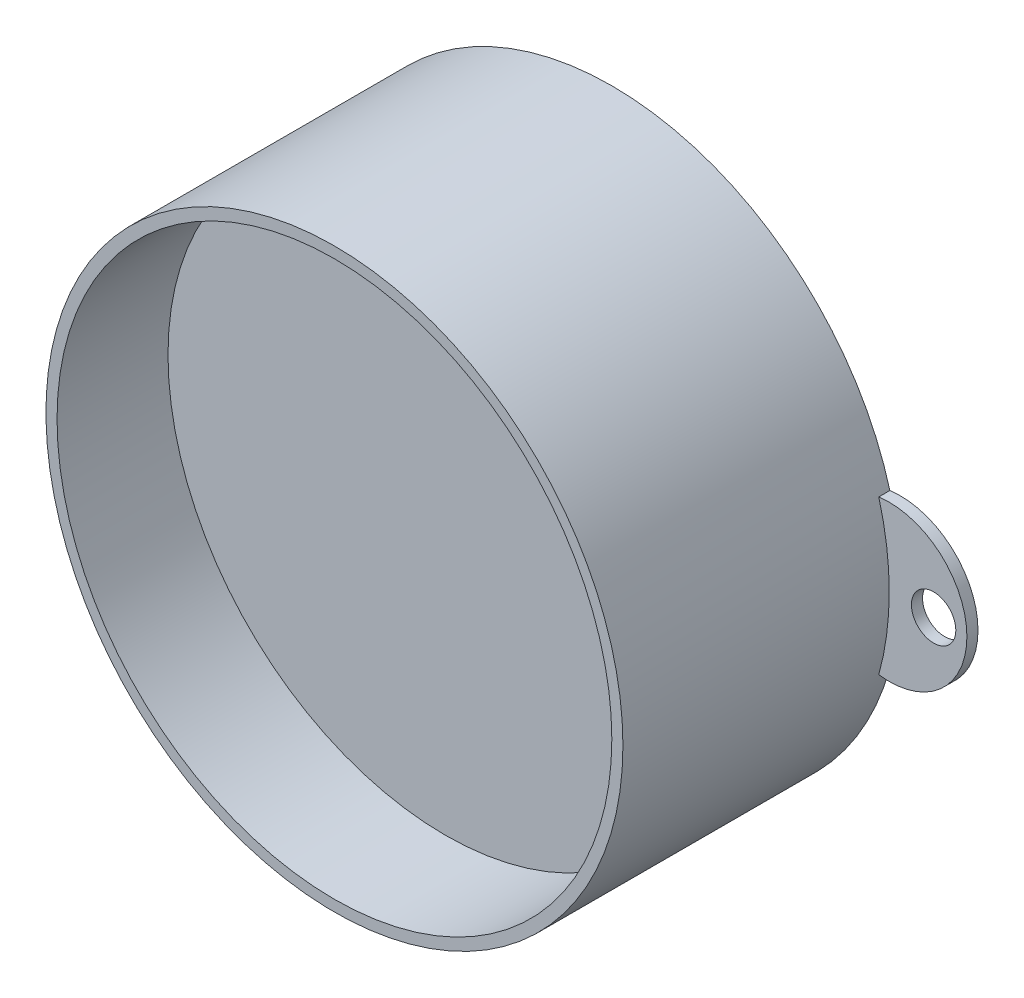
ISO-10303-21;
HEADER;
FILE_DESCRIPTION(('STEP AP214'),'2;1');
FILE_NAME('part.step','',(''),(''),'','','');
FILE_SCHEMA(('AUTOMOTIVE_DESIGN { 1 0 10303 214 1 1 1 1 }'));
ENDSEC;
DATA;
#1=APPLICATION_CONTEXT('core data for automotive mechanical design processes');
#2=APPLICATION_PROTOCOL_DEFINITION('international standard','automotive_design',2000,#1);
#3=PRODUCT_CONTEXT('',#1,'mechanical');
#4=PRODUCT('Part','Part','',(#3));
#5=PRODUCT_RELATED_PRODUCT_CATEGORY('part','',(#4));
#6=PRODUCT_DEFINITION_FORMATION('','',#4);
#7=PRODUCT_DEFINITION_CONTEXT('part definition',#1,'design');
#8=PRODUCT_DEFINITION('design','',#6,#7);
#9=PRODUCT_DEFINITION_SHAPE('','',#8);
#10=(LENGTH_UNIT() NAMED_UNIT(*) SI_UNIT(.MILLI.,.METRE.));
#11=(NAMED_UNIT(*) PLANE_ANGLE_UNIT() SI_UNIT($,.RADIAN.));
#12=(NAMED_UNIT(*) SI_UNIT($,.STERADIAN.) SOLID_ANGLE_UNIT());
#13=UNCERTAINTY_MEASURE_WITH_UNIT(LENGTH_MEASURE(1.E-05),#10,'distance_accuracy_value','');
#14=(GEOMETRIC_REPRESENTATION_CONTEXT(3) GLOBAL_UNCERTAINTY_ASSIGNED_CONTEXT((#13)) GLOBAL_UNIT_ASSIGNED_CONTEXT((#10,
#11,#12)) REPRESENTATION_CONTEXT('',''));
#15=CARTESIAN_POINT('',(0.,0.,0.));
#16=DIRECTION('',(0.,0.,1.));
#17=DIRECTION('',(1.,0.,0.));
#18=AXIS2_PLACEMENT_3D('',#15,#16,#17);
#19=CARTESIAN_POINT('',(0.,0.,1.));
#20=DIRECTION('',(0.,0.,1.));
#21=DIRECTION('',(1.,0.,0.));
#22=AXIS2_PLACEMENT_3D('',#19,#20,#21);
#23=PLANE('',#22);
#24=CARTESIAN_POINT('',(-30.,0.,1.));
#25=DIRECTION('',(0.,0.,1.));
#26=DIRECTION('',(1.,0.,0.));
#27=AXIS2_PLACEMENT_3D('',#24,#25,#26);
#28=CIRCLE('',#27,2.);
#29=CARTESIAN_POINT('',(-28.,0.,1.));
#30=VERTEX_POINT('',#29);
#31=EDGE_CURVE('E100',#30,#30,#28,.T.);
#32=ORIENTED_EDGE('',*,*,#31,.F.);
#33=EDGE_LOOP('',(#32));
#34=FACE_BOUND('',#33,.T.);
#35=CARTESIAN_POINT('',(-26.,0.,1.));
#36=DIRECTION('',(0.,0.,1.));
#37=DIRECTION('',(1.,0.,0.));
#38=AXIS2_PLACEMENT_3D('',#35,#36,#37);
#39=CIRCLE('',#38,7.);
#40=CARTESIAN_POINT('',(-25.0576923076923,6.93628547660906,1.));
#41=VERTEX_POINT('',#40);
#42=CARTESIAN_POINT('',(-25.0576923076923,-6.93628547660906,1.));
#43=VERTEX_POINT('',#42);
#44=EDGE_CURVE('E106',#41,#43,#39,.T.);
#45=ORIENTED_EDGE('',*,*,#44,.T.);
#46=CARTESIAN_POINT('',(0.,0.,1.));
#47=DIRECTION('',(0.,0.,1.));
#48=DIRECTION('',(1.,0.,0.));
#49=AXIS2_PLACEMENT_3D('',#46,#47,#48);
#50=CIRCLE('',#49,26.);
#51=EDGE_CURVE('E84',#43,#41,#50,.F.);
#52=ORIENTED_EDGE('',*,*,#51,.T.);
#53=EDGE_LOOP('',(#45,#52));
#54=FACE_BOUND('',#53,.T.);
#55=ADVANCED_FACE('F33',(#34,#54),#23,.T.);
#56=CARTESIAN_POINT('',(26.,0.,1.));
#57=DIRECTION('',(0.,0.,-1.));
#58=DIRECTION('',(-1.,0.,0.));
#59=AXIS2_PLACEMENT_3D('',#56,#57,#58);
#60=CYLINDRICAL_SURFACE('',#59,7.);
#61=CARTESIAN_POINT('',(26.,0.,0.));
#62=DIRECTION('',(0.,0.,1.));
#63=DIRECTION('',(1.,0.,0.));
#64=AXIS2_PLACEMENT_3D('',#61,#62,#63);
#65=CIRCLE('',#64,7.);
#66=CARTESIAN_POINT('',(25.0576923076923,6.93628547660906,0.));
#67=VERTEX_POINT('',#66);
#68=CARTESIAN_POINT('',(25.0576923076923,-6.93628547660906,0.));
#69=VERTEX_POINT('',#68);
#70=EDGE_CURVE('E91',#67,#69,#65,.F.);
#71=ORIENTED_EDGE('',*,*,#70,.F.);
#72=DIRECTION('',(0.,0.,-1.));
#73=VECTOR('',#72,1.);
#74=CARTESIAN_POINT('',(25.0576923076923,6.93628547660906,1.));
#75=LINE('',#74,#73);
#76=CARTESIAN_POINT('',(25.0576923076923,6.93628547660906,1.));
#77=VERTEX_POINT('',#76);
#78=EDGE_CURVE('E11',#77,#67,#75,.T.);
#79=ORIENTED_EDGE('',*,*,#78,.F.);
#80=CARTESIAN_POINT('',(26.,0.,1.));
#81=DIRECTION('',(0.,0.,1.));
#82=DIRECTION('',(1.,0.,0.));
#83=AXIS2_PLACEMENT_3D('',#80,#81,#82);
#84=CIRCLE('',#83,7.);
#85=CARTESIAN_POINT('',(25.0576923076923,-6.93628547660906,1.));
#86=VERTEX_POINT('',#85);
#87=EDGE_CURVE('E108',#77,#86,#84,.F.);
#88=ORIENTED_EDGE('',*,*,#87,.T.);
#89=DIRECTION('',(0.,0.,-1.));
#90=VECTOR('',#89,1.);
#91=CARTESIAN_POINT('',(25.0576923076923,-6.93628547660906,1.));
#92=LINE('',#91,#90);
#93=EDGE_CURVE('E86',#86,#69,#92,.T.);
#94=ORIENTED_EDGE('',*,*,#93,.T.);
#95=EDGE_LOOP('',(#71,#79,#88,#94));
#96=FACE_BOUND('',#95,.T.);
#97=ADVANCED_FACE('F35',(#96),#60,.T.);
#98=CARTESIAN_POINT('',(-26.,0.,1.));
#99=DIRECTION('',(0.,0.,-1.));
#100=DIRECTION('',(-1.,0.,0.));
#101=AXIS2_PLACEMENT_3D('',#98,#99,#100);
#102=CYLINDRICAL_SURFACE('',#101,7.);
#103=CARTESIAN_POINT('',(-26.,0.,0.));
#104=DIRECTION('',(0.,0.,1.));
#105=DIRECTION('',(1.,0.,0.));
#106=AXIS2_PLACEMENT_3D('',#103,#104,#105);
#107=CIRCLE('',#106,7.);
#108=CARTESIAN_POINT('',(-25.0576923076923,6.93628547660906,0.));
#109=VERTEX_POINT('',#108);
#110=CARTESIAN_POINT('',(-25.0576923076923,-6.93628547660906,0.));
#111=VERTEX_POINT('',#110);
#112=EDGE_CURVE('E65',#109,#111,#107,.T.);
#113=ORIENTED_EDGE('',*,*,#112,.T.);
#114=DIRECTION('',(0.,0.,-1.));
#115=VECTOR('',#114,1.);
#116=CARTESIAN_POINT('',(-25.0576923076923,-6.93628547660906,1.));
#117=LINE('',#116,#115);
#118=EDGE_CURVE('E69',#43,#111,#117,.T.);
#119=ORIENTED_EDGE('',*,*,#118,.F.);
#120=ORIENTED_EDGE('',*,*,#44,.F.);
#121=DIRECTION('',(0.,0.,-1.));
#122=VECTOR('',#121,1.);
#123=CARTESIAN_POINT('',(-25.0576923076923,6.93628547660906,1.));
#124=LINE('',#123,#122);
#125=EDGE_CURVE('E42',#41,#109,#124,.T.);
#126=ORIENTED_EDGE('',*,*,#125,.T.);
#127=EDGE_LOOP('',(#113,#119,#120,#126));
#128=FACE_BOUND('',#127,.T.);
#129=ADVANCED_FACE('F67',(#128),#102,.T.);
#130=CARTESIAN_POINT('',(30.,0.,1.));
#131=DIRECTION('',(0.,0.,-1.));
#132=DIRECTION('',(-1.,0.,0.));
#133=AXIS2_PLACEMENT_3D('',#130,#131,#132);
#134=CYLINDRICAL_SURFACE('',#133,2.);
#135=CARTESIAN_POINT('',(30.,0.,1.));
#136=DIRECTION('',(0.,0.,1.));
#137=DIRECTION('',(1.,0.,0.));
#138=AXIS2_PLACEMENT_3D('',#135,#136,#137);
#139=CIRCLE('',#138,2.);
#140=CARTESIAN_POINT('',(32.,0.,1.));
#141=VERTEX_POINT('',#140);
#142=EDGE_CURVE('E103',#141,#141,#139,.F.);
#143=ORIENTED_EDGE('',*,*,#142,.F.);
#144=EDGE_LOOP('',(#143));
#145=FACE_BOUND('',#144,.T.);
#146=CARTESIAN_POINT('',(30.,0.,0.));
#147=DIRECTION('',(0.,0.,1.));
#148=DIRECTION('',(1.,0.,0.));
#149=AXIS2_PLACEMENT_3D('',#146,#147,#148);
#150=CIRCLE('',#149,2.);
#151=CARTESIAN_POINT('',(32.,0.,0.));
#152=VERTEX_POINT('',#151);
#153=EDGE_CURVE('E92',#152,#152,#150,.F.);
#154=ORIENTED_EDGE('',*,*,#153,.T.);
#155=EDGE_LOOP('',(#154));
#156=FACE_BOUND('',#155,.T.);
#157=ADVANCED_FACE('F136',(#145,#156),#134,.F.);
#158=CARTESIAN_POINT('',(0.,0.,1.));
#159=DIRECTION('',(0.,0.,-1.));
#160=DIRECTION('',(-1.,0.,0.));
#161=AXIS2_PLACEMENT_3D('',#158,#159,#160);
#162=CYLINDRICAL_SURFACE('',#161,26.);
#163=CARTESIAN_POINT('',(0.,0.,0.));
#164=DIRECTION('',(0.,0.,1.));
#165=DIRECTION('',(1.,0.,0.));
#166=AXIS2_PLACEMENT_3D('',#163,#164,#165);
#167=CIRCLE('',#166,26.);
#168=EDGE_CURVE('E74',#111,#69,#167,.T.);
#169=ORIENTED_EDGE('',*,*,#168,.T.);
#170=ORIENTED_EDGE('',*,*,#93,.F.);
#171=EDGE_CURVE('E48',#77,#86,#50,.F.);
#172=ORIENTED_EDGE('',*,*,#171,.F.);
#173=ORIENTED_EDGE('',*,*,#78,.T.);
#174=EDGE_CURVE('E75',#67,#109,#167,.T.);
#175=ORIENTED_EDGE('',*,*,#174,.T.);
#176=ORIENTED_EDGE('',*,*,#125,.F.);
#177=ORIENTED_EDGE('',*,*,#51,.F.);
#178=ORIENTED_EDGE('',*,*,#118,.T.);
#179=EDGE_LOOP('',(#169,#170,#172,#173,#175,#176,#177,#178));
#180=FACE_BOUND('',#179,.T.);
#181=CARTESIAN_POINT('',(0.,0.,25.));
#182=DIRECTION('',(0.,0.,1.));
#183=DIRECTION('',(1.,0.,0.));
#184=AXIS2_PLACEMENT_3D('',#181,#182,#183);
#185=CIRCLE('',#184,26.);
#186=CARTESIAN_POINT('',(26.,0.,25.));
#187=VERTEX_POINT('',#186);
#188=EDGE_CURVE('E111',#187,#187,#185,.T.);
#189=ORIENTED_EDGE('',*,*,#188,.F.);
#190=EDGE_LOOP('',(#189));
#191=FACE_BOUND('',#190,.T.);
#192=ADVANCED_FACE('F80',(#180,#191),#162,.T.);
#193=CARTESIAN_POINT('',(-30.,0.,1.));
#194=DIRECTION('',(0.,0.,-1.));
#195=DIRECTION('',(-1.,0.,0.));
#196=AXIS2_PLACEMENT_3D('',#193,#194,#195);
#197=CYLINDRICAL_SURFACE('',#196,2.);
#198=ORIENTED_EDGE('',*,*,#31,.T.);
#199=EDGE_LOOP('',(#198));
#200=FACE_BOUND('',#199,.T.);
#201=CARTESIAN_POINT('',(-30.,0.,0.));
#202=DIRECTION('',(0.,0.,1.));
#203=DIRECTION('',(1.,0.,0.));
#204=AXIS2_PLACEMENT_3D('',#201,#202,#203);
#205=CIRCLE('',#204,2.);
#206=CARTESIAN_POINT('',(-28.,0.,0.));
#207=VERTEX_POINT('',#206);
#208=EDGE_CURVE('E95',#207,#207,#205,.T.);
#209=ORIENTED_EDGE('',*,*,#208,.F.);
#210=EDGE_LOOP('',(#209));
#211=FACE_BOUND('',#210,.T.);
#212=ADVANCED_FACE('F135',(#200,#211),#197,.F.);
#213=ORIENTED_EDGE('',*,*,#87,.F.);
#214=ORIENTED_EDGE('',*,*,#171,.T.);
#215=EDGE_LOOP('',(#213,#214));
#216=FACE_BOUND('',#215,.T.);
#217=ORIENTED_EDGE('',*,*,#142,.T.);
#218=EDGE_LOOP('',(#217));
#219=FACE_BOUND('',#218,.T.);
#220=ADVANCED_FACE('F142',(#216,#219),#23,.T.);
#221=CARTESIAN_POINT('',(0.,0.,0.));
#222=DIRECTION('',(0.,0.,1.));
#223=DIRECTION('',(1.,0.,0.));
#224=AXIS2_PLACEMENT_3D('',#221,#222,#223);
#225=PLANE('',#224);
#226=ORIENTED_EDGE('',*,*,#70,.T.);
#227=ORIENTED_EDGE('',*,*,#168,.F.);
#228=ORIENTED_EDGE('',*,*,#112,.F.);
#229=ORIENTED_EDGE('',*,*,#174,.F.);
#230=EDGE_LOOP('',(#226,#227,#228,#229));
#231=FACE_BOUND('',#230,.T.);
#232=ORIENTED_EDGE('',*,*,#153,.F.);
#233=EDGE_LOOP('',(#232));
#234=FACE_BOUND('',#233,.T.);
#235=ORIENTED_EDGE('',*,*,#208,.T.);
#236=EDGE_LOOP('',(#235));
#237=FACE_BOUND('',#236,.T.);
#238=ADVANCED_FACE('F88',(#231,#234,#237),#225,.F.);
#239=CARTESIAN_POINT('',(0.,0.,25.));
#240=DIRECTION('',(0.,0.,1.));
#241=DIRECTION('',(1.,0.,0.));
#242=AXIS2_PLACEMENT_3D('',#239,#240,#241);
#243=PLANE('',#242);
#244=CARTESIAN_POINT('',(0.,0.,25.));
#245=DIRECTION('',(0.,0.,1.));
#246=DIRECTION('',(1.,0.,0.));
#247=AXIS2_PLACEMENT_3D('',#244,#245,#246);
#248=CIRCLE('',#247,25.);
#249=CARTESIAN_POINT('',(25.,0.,25.));
#250=VERTEX_POINT('',#249);
#251=EDGE_CURVE('E115',#250,#250,#248,.T.);
#252=ORIENTED_EDGE('',*,*,#251,.F.);
#253=EDGE_LOOP('',(#252));
#254=FACE_BOUND('',#253,.T.);
#255=ORIENTED_EDGE('',*,*,#188,.T.);
#256=EDGE_LOOP('',(#255));
#257=FACE_BOUND('',#256,.T.);
#258=ADVANCED_FACE('F126',(#254,#257),#243,.T.);
#259=CARTESIAN_POINT('',(0.,0.,15.));
#260=DIRECTION('',(0.,0.,1.));
#261=DIRECTION('',(1.,0.,0.));
#262=AXIS2_PLACEMENT_3D('',#259,#260,#261);
#263=CYLINDRICAL_SURFACE('',#262,25.);
#264=CARTESIAN_POINT('',(0.,0.,15.));
#265=DIRECTION('',(0.,0.,1.));
#266=DIRECTION('',(1.,0.,0.));
#267=AXIS2_PLACEMENT_3D('',#264,#265,#266);
#268=CIRCLE('',#267,25.);
#269=CARTESIAN_POINT('',(25.,0.,15.));
#270=VERTEX_POINT('',#269);
#271=EDGE_CURVE('E114',#270,#270,#268,.T.);
#272=ORIENTED_EDGE('',*,*,#271,.F.);
#273=EDGE_LOOP('',(#272));
#274=FACE_BOUND('',#273,.T.);
#275=ORIENTED_EDGE('',*,*,#251,.T.);
#276=EDGE_LOOP('',(#275));
#277=FACE_BOUND('',#276,.T.);
#278=ADVANCED_FACE('F123',(#274,#277),#263,.F.);
#279=CARTESIAN_POINT('',(0.,0.,15.));
#280=DIRECTION('',(0.,0.,1.));
#281=DIRECTION('',(1.,0.,0.));
#282=AXIS2_PLACEMENT_3D('',#279,#280,#281);
#283=PLANE('',#282);
#284=ORIENTED_EDGE('',*,*,#271,.T.);
#285=EDGE_LOOP('',(#284));
#286=FACE_BOUND('',#285,.T.);
#287=ADVANCED_FACE('F121',(#286),#283,.T.);
#288=CLOSED_SHELL('',(#55,#97,#129,#157,#192,#212,#220,#238,#258,#278,#287));
#289=MANIFOLD_SOLID_BREP('B2',#288);
#290=ADVANCED_BREP_SHAPE_REPRESENTATION('',(#18,#289),#14);
#291=SHAPE_DEFINITION_REPRESENTATION(#9,#290);
ENDSEC;
END-ISO-10303-21;
